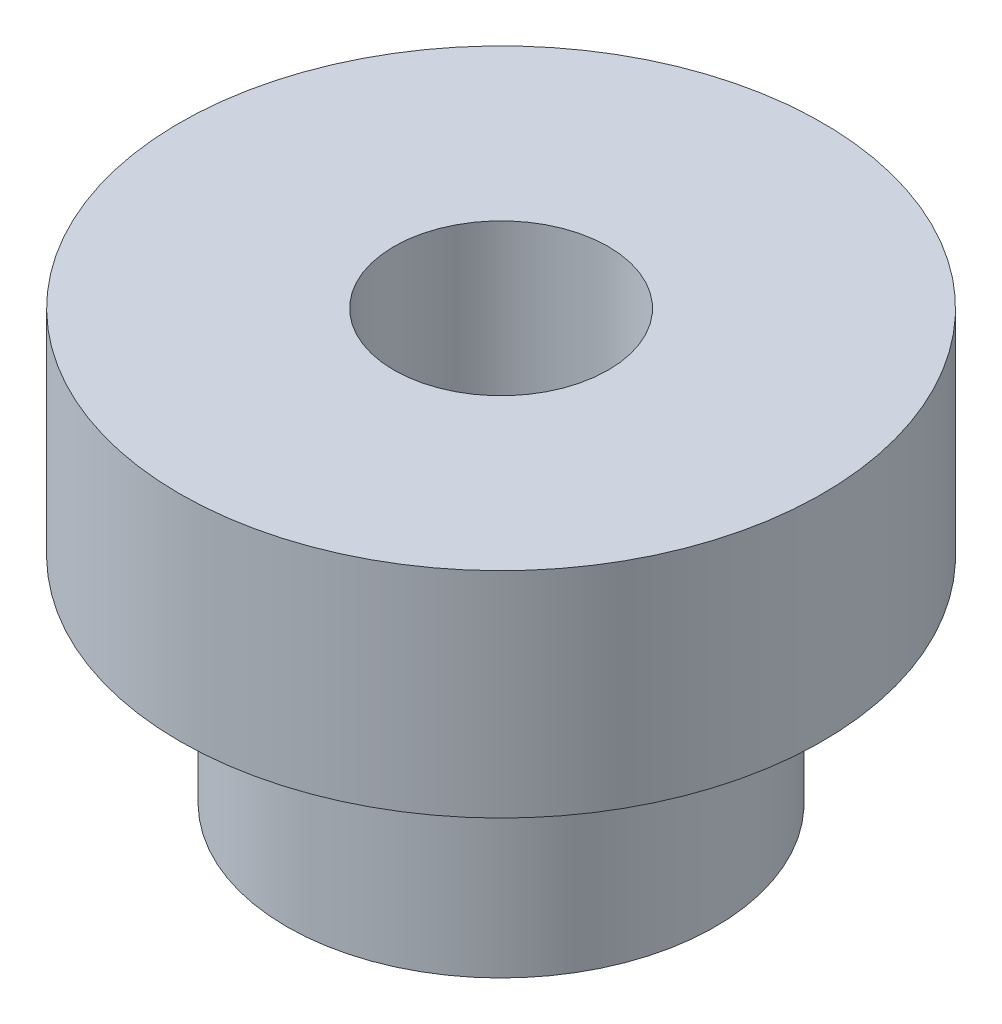
ISO-10303-21;
HEADER;
FILE_DESCRIPTION(('STEP AP214'),'2;1');
FILE_NAME('part.step','',(''),(''),'','','');
FILE_SCHEMA(('AUTOMOTIVE_DESIGN { 1 0 10303 214 1 1 1 1 }'));
ENDSEC;
DATA;
#1=APPLICATION_CONTEXT('core data for automotive mechanical design processes');
#2=APPLICATION_PROTOCOL_DEFINITION('international standard','automotive_design',2000,#1);
#3=PRODUCT_CONTEXT('',#1,'mechanical');
#4=PRODUCT('Part','Part','',(#3));
#5=PRODUCT_RELATED_PRODUCT_CATEGORY('part','',(#4));
#6=PRODUCT_DEFINITION_FORMATION('','',#4);
#7=PRODUCT_DEFINITION_CONTEXT('part definition',#1,'design');
#8=PRODUCT_DEFINITION('design','',#6,#7);
#9=PRODUCT_DEFINITION_SHAPE('','',#8);
#10=(LENGTH_UNIT() NAMED_UNIT(*) SI_UNIT(.MILLI.,.METRE.));
#11=(NAMED_UNIT(*) PLANE_ANGLE_UNIT() SI_UNIT($,.RADIAN.));
#12=(NAMED_UNIT(*) SI_UNIT($,.STERADIAN.) SOLID_ANGLE_UNIT());
#13=UNCERTAINTY_MEASURE_WITH_UNIT(LENGTH_MEASURE(1.E-05),#10,'distance_accuracy_value','');
#14=(GEOMETRIC_REPRESENTATION_CONTEXT(3) GLOBAL_UNCERTAINTY_ASSIGNED_CONTEXT((#13)) GLOBAL_UNIT_ASSIGNED_CONTEXT((#10,
#11,#12)) REPRESENTATION_CONTEXT('',''));
#15=CARTESIAN_POINT('',(0.,0.,0.));
#16=DIRECTION('',(0.,0.,1.));
#17=DIRECTION('',(1.,0.,0.));
#18=AXIS2_PLACEMENT_3D('',#15,#16,#17);
#19=CARTESIAN_POINT('',(0.,0.,0.));
#20=DIRECTION('',(0.,1.,0.));
#21=DIRECTION('',(0.,0.,1.));
#22=AXIS2_PLACEMENT_3D('',#19,#20,#21);
#23=PLANE('',#22);
#24=CARTESIAN_POINT('',(0.,0.,0.));
#25=DIRECTION('',(0.,1.,0.));
#26=DIRECTION('',(0.,0.,1.));
#27=AXIS2_PLACEMENT_3D('',#24,#25,#26);
#28=CIRCLE('',#27,2.);
#29=CARTESIAN_POINT('',(0.,0.,2.));
#30=VERTEX_POINT('',#29);
#31=EDGE_CURVE('E35',#30,#30,#28,.T.);
#32=ORIENTED_EDGE('',*,*,#31,.F.);
#33=EDGE_LOOP('',(#32));
#34=FACE_BOUND('',#33,.T.);
#35=CARTESIAN_POINT('',(0.,0.,0.));
#36=DIRECTION('',(0.,1.,0.));
#37=DIRECTION('',(0.,0.,1.));
#38=AXIS2_PLACEMENT_3D('',#35,#36,#37);
#39=CIRCLE('',#38,1.);
#40=CARTESIAN_POINT('',(0.,0.,1.));
#41=VERTEX_POINT('',#40);
#42=EDGE_CURVE('E42',#41,#41,#39,.T.);
#43=ORIENTED_EDGE('',*,*,#42,.T.);
#44=EDGE_LOOP('',(#43));
#45=FACE_BOUND('',#44,.T.);
#46=ADVANCED_FACE('F31',(#34,#45),#23,.F.);
#47=CARTESIAN_POINT('',(0.,2.,0.));
#48=DIRECTION('',(0.,-1.,0.));
#49=DIRECTION('',(0.,0.,-1.));
#50=AXIS2_PLACEMENT_3D('',#47,#48,#49);
#51=CYLINDRICAL_SURFACE('',#50,2.);
#52=CARTESIAN_POINT('',(0.,2.,0.));
#53=DIRECTION('',(0.,1.,0.));
#54=DIRECTION('',(0.,0.,1.));
#55=AXIS2_PLACEMENT_3D('',#52,#53,#54);
#56=CIRCLE('',#55,2.);
#57=CARTESIAN_POINT('',(0.,2.,2.));
#58=VERTEX_POINT('',#57);
#59=EDGE_CURVE('E10',#58,#58,#56,.T.);
#60=ORIENTED_EDGE('',*,*,#59,.F.);
#61=EDGE_LOOP('',(#60));
#62=FACE_BOUND('',#61,.T.);
#63=ORIENTED_EDGE('',*,*,#31,.T.);
#64=EDGE_LOOP('',(#63));
#65=FACE_BOUND('',#64,.T.);
#66=ADVANCED_FACE('F33',(#62,#65),#51,.T.);
#67=CARTESIAN_POINT('',(0.,2.,0.));
#68=DIRECTION('',(0.,-1.,0.));
#69=DIRECTION('',(0.,0.,-1.));
#70=AXIS2_PLACEMENT_3D('',#67,#68,#69);
#71=CYLINDRICAL_SURFACE('',#70,1.);
#72=ORIENTED_EDGE('',*,*,#42,.F.);
#73=EDGE_LOOP('',(#72));
#74=FACE_BOUND('',#73,.T.);
#75=CARTESIAN_POINT('',(0.,4.,0.));
#76=DIRECTION('',(0.,1.,0.));
#77=DIRECTION('',(0.,0.,1.));
#78=AXIS2_PLACEMENT_3D('',#75,#76,#77);
#79=CIRCLE('',#78,1.);
#80=CARTESIAN_POINT('',(0.,4.,1.));
#81=VERTEX_POINT('',#80);
#82=EDGE_CURVE('E50',#81,#81,#79,.T.);
#83=ORIENTED_EDGE('',*,*,#82,.T.);
#84=EDGE_LOOP('',(#83));
#85=FACE_BOUND('',#84,.T.);
#86=ADVANCED_FACE('F56',(#74,#85),#71,.F.);
#87=CARTESIAN_POINT('',(0.,4.,0.));
#88=DIRECTION('',(0.,1.,0.));
#89=DIRECTION('',(0.,0.,1.));
#90=AXIS2_PLACEMENT_3D('',#87,#88,#89);
#91=PLANE('',#90);
#92=CARTESIAN_POINT('',(0.,4.,0.));
#93=DIRECTION('',(0.,1.,0.));
#94=DIRECTION('',(0.,0.,1.));
#95=AXIS2_PLACEMENT_3D('',#92,#93,#94);
#96=CIRCLE('',#95,3.);
#97=CARTESIAN_POINT('',(0.,4.,3.));
#98=VERTEX_POINT('',#97);
#99=EDGE_CURVE('E46',#98,#98,#96,.T.);
#100=ORIENTED_EDGE('',*,*,#99,.T.);
#101=EDGE_LOOP('',(#100));
#102=FACE_BOUND('',#101,.T.);
#103=ORIENTED_EDGE('',*,*,#82,.F.);
#104=EDGE_LOOP('',(#103));
#105=FACE_BOUND('',#104,.T.);
#106=ADVANCED_FACE('F58',(#102,#105),#91,.T.);
#107=CARTESIAN_POINT('',(0.,2.,0.));
#108=DIRECTION('',(0.,1.,0.));
#109=DIRECTION('',(0.,0.,1.));
#110=AXIS2_PLACEMENT_3D('',#107,#108,#109);
#111=PLANE('',#110);
#112=ORIENTED_EDGE('',*,*,#59,.T.);
#113=EDGE_LOOP('',(#112));
#114=FACE_BOUND('',#113,.T.);
#115=CARTESIAN_POINT('',(0.,2.,0.));
#116=DIRECTION('',(0.,1.,0.));
#117=DIRECTION('',(0.,0.,1.));
#118=AXIS2_PLACEMENT_3D('',#115,#116,#117);
#119=CIRCLE('',#118,3.);
#120=CARTESIAN_POINT('',(0.,2.,3.));
#121=VERTEX_POINT('',#120);
#122=EDGE_CURVE('E47',#121,#121,#119,.T.);
#123=ORIENTED_EDGE('',*,*,#122,.F.);
#124=EDGE_LOOP('',(#123));
#125=FACE_BOUND('',#124,.T.);
#126=ADVANCED_FACE('F60',(#114,#125),#111,.F.);
#127=CARTESIAN_POINT('',(0.,4.,0.));
#128=DIRECTION('',(0.,-1.,0.));
#129=DIRECTION('',(0.,0.,-1.));
#130=AXIS2_PLACEMENT_3D('',#127,#128,#129);
#131=CYLINDRICAL_SURFACE('',#130,3.);
#132=ORIENTED_EDGE('',*,*,#99,.F.);
#133=EDGE_LOOP('',(#132));
#134=FACE_BOUND('',#133,.T.);
#135=ORIENTED_EDGE('',*,*,#122,.T.);
#136=EDGE_LOOP('',(#135));
#137=FACE_BOUND('',#136,.T.);
#138=ADVANCED_FACE('F67',(#134,#137),#131,.T.);
#139=CLOSED_SHELL('',(#46,#66,#86,#106,#126,#138));
#140=MANIFOLD_SOLID_BREP('B2',#139);
#141=ADVANCED_BREP_SHAPE_REPRESENTATION('',(#18,#140),#14);
#142=SHAPE_DEFINITION_REPRESENTATION(#9,#141);
ENDSEC;
END-ISO-10303-21;
